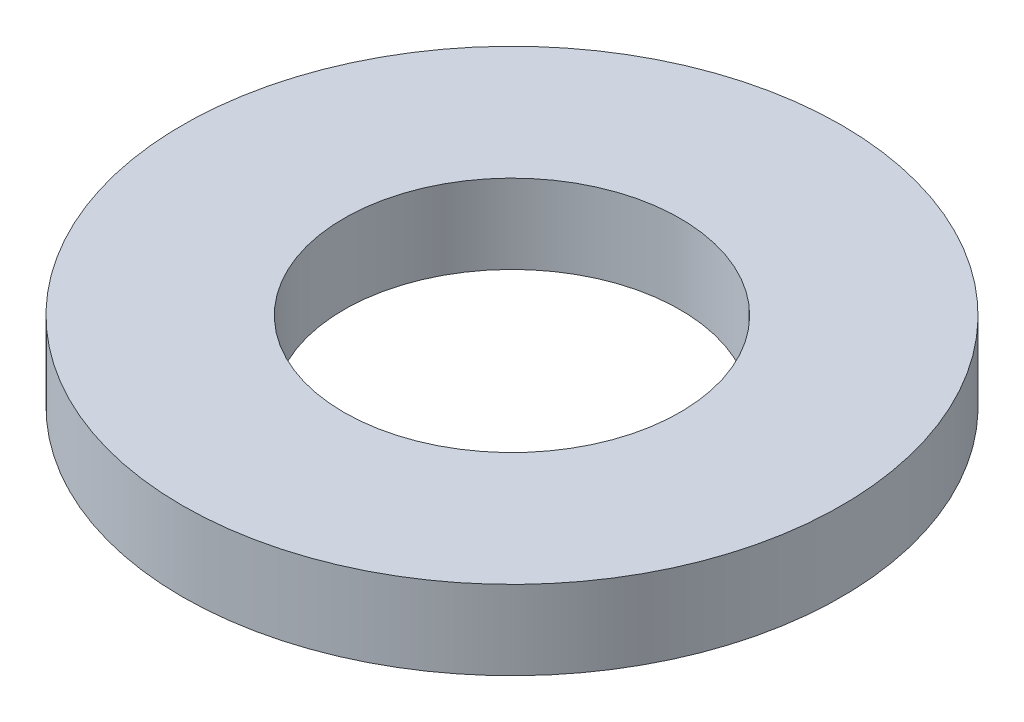
ISO-10303-21;
HEADER;
FILE_DESCRIPTION(('STEP AP214'),'2;1');
FILE_NAME('part.step','',(''),(''),'','','');
FILE_SCHEMA(('AUTOMOTIVE_DESIGN { 1 0 10303 214 1 1 1 1 }'));
ENDSEC;
DATA;
#1=APPLICATION_CONTEXT('core data for automotive mechanical design processes');
#2=APPLICATION_PROTOCOL_DEFINITION('international standard','automotive_design',2000,#1);
#3=PRODUCT_CONTEXT('',#1,'mechanical');
#4=PRODUCT('Part','Part','',(#3));
#5=PRODUCT_RELATED_PRODUCT_CATEGORY('part','',(#4));
#6=PRODUCT_DEFINITION_FORMATION('','',#4);
#7=PRODUCT_DEFINITION_CONTEXT('part definition',#1,'design');
#8=PRODUCT_DEFINITION('design','',#6,#7);
#9=PRODUCT_DEFINITION_SHAPE('','',#8);
#10=(LENGTH_UNIT() NAMED_UNIT(*) SI_UNIT(.MILLI.,.METRE.));
#11=(NAMED_UNIT(*) PLANE_ANGLE_UNIT() SI_UNIT($,.RADIAN.));
#12=(NAMED_UNIT(*) SI_UNIT($,.STERADIAN.) SOLID_ANGLE_UNIT());
#13=UNCERTAINTY_MEASURE_WITH_UNIT(LENGTH_MEASURE(1.E-05),#10,'distance_accuracy_value','');
#14=(GEOMETRIC_REPRESENTATION_CONTEXT(3) GLOBAL_UNCERTAINTY_ASSIGNED_CONTEXT((#13)) GLOBAL_UNIT_ASSIGNED_CONTEXT((#10,
#11,#12)) REPRESENTATION_CONTEXT('',''));
#15=CARTESIAN_POINT('',(0.,0.,0.));
#16=DIRECTION('',(0.,0.,1.));
#17=DIRECTION('',(1.,0.,0.));
#18=AXIS2_PLACEMENT_3D('',#15,#16,#17);
#19=CARTESIAN_POINT('',(0.,1.2,0.));
#20=DIRECTION('',(0.,-1.,0.));
#21=DIRECTION('',(0.,0.,-1.));
#22=AXIS2_PLACEMENT_3D('',#19,#20,#21);
#23=CYLINDRICAL_SURFACE('',#22,5.);
#24=CARTESIAN_POINT('',(0.,1.2,0.));
#25=DIRECTION('',(0.,1.,0.));
#26=DIRECTION('',(0.,0.,1.));
#27=AXIS2_PLACEMENT_3D('',#24,#25,#26);
#28=CIRCLE('',#27,5.);
#29=CARTESIAN_POINT('',(0.,1.2,5.));
#30=VERTEX_POINT('',#29);
#31=EDGE_CURVE('E10',#30,#30,#28,.T.);
#32=ORIENTED_EDGE('',*,*,#31,.F.);
#33=EDGE_LOOP('',(#32));
#34=FACE_BOUND('',#33,.T.);
#35=CARTESIAN_POINT('',(0.,0.,0.));
#36=DIRECTION('',(0.,1.,0.));
#37=DIRECTION('',(0.,0.,1.));
#38=AXIS2_PLACEMENT_3D('',#35,#36,#37);
#39=CIRCLE('',#38,5.);
#40=CARTESIAN_POINT('',(0.,0.,5.));
#41=VERTEX_POINT('',#40);
#42=EDGE_CURVE('E37',#41,#41,#39,.T.);
#43=ORIENTED_EDGE('',*,*,#42,.T.);
#44=EDGE_LOOP('',(#43));
#45=FACE_BOUND('',#44,.T.);
#46=ADVANCED_FACE('F34',(#34,#45),#23,.T.);
#47=CARTESIAN_POINT('',(0.,1.2,0.));
#48=DIRECTION('',(0.,1.,0.));
#49=DIRECTION('',(0.,0.,1.));
#50=AXIS2_PLACEMENT_3D('',#47,#48,#49);
#51=PLANE('',#50);
#52=CARTESIAN_POINT('',(0.,1.2,0.));
#53=DIRECTION('',(0.,1.,0.));
#54=DIRECTION('',(0.,0.,1.));
#55=AXIS2_PLACEMENT_3D('',#52,#53,#54);
#56=CIRCLE('',#55,2.55);
#57=CARTESIAN_POINT('',(0.,1.2,2.55));
#58=VERTEX_POINT('',#57);
#59=EDGE_CURVE('E46',#58,#58,#56,.T.);
#60=ORIENTED_EDGE('',*,*,#59,.F.);
#61=EDGE_LOOP('',(#60));
#62=FACE_BOUND('',#61,.T.);
#63=ORIENTED_EDGE('',*,*,#31,.T.);
#64=EDGE_LOOP('',(#63));
#65=FACE_BOUND('',#64,.T.);
#66=ADVANCED_FACE('F61',(#62,#65),#51,.T.);
#67=CARTESIAN_POINT('',(0.,0.,0.));
#68=DIRECTION('',(0.,1.,0.));
#69=DIRECTION('',(0.,0.,1.));
#70=AXIS2_PLACEMENT_3D('',#67,#68,#69);
#71=PLANE('',#70);
#72=CARTESIAN_POINT('',(0.,0.,0.));
#73=DIRECTION('',(0.,1.,0.));
#74=DIRECTION('',(0.,0.,1.));
#75=AXIS2_PLACEMENT_3D('',#72,#73,#74);
#76=CIRCLE('',#75,2.55);
#77=CARTESIAN_POINT('',(0.,0.,2.55));
#78=VERTEX_POINT('',#77);
#79=EDGE_CURVE('E44',#78,#78,#76,.T.);
#80=ORIENTED_EDGE('',*,*,#79,.T.);
#81=EDGE_LOOP('',(#80));
#82=FACE_BOUND('',#81,.T.);
#83=ORIENTED_EDGE('',*,*,#42,.F.);
#84=EDGE_LOOP('',(#83));
#85=FACE_BOUND('',#84,.T.);
#86=ADVANCED_FACE('F52',(#82,#85),#71,.F.);
#87=CARTESIAN_POINT('',(0.,0.,0.));
#88=DIRECTION('',(0.,1.,0.));
#89=DIRECTION('',(0.,0.,1.));
#90=AXIS2_PLACEMENT_3D('',#87,#88,#89);
#91=CYLINDRICAL_SURFACE('',#90,2.55);
#92=ORIENTED_EDGE('',*,*,#79,.F.);
#93=EDGE_LOOP('',(#92));
#94=FACE_BOUND('',#93,.T.);
#95=ORIENTED_EDGE('',*,*,#59,.T.);
#96=EDGE_LOOP('',(#95));
#97=FACE_BOUND('',#96,.T.);
#98=ADVANCED_FACE('F55',(#94,#97),#91,.F.);
#99=CLOSED_SHELL('',(#46,#66,#86,#98));
#100=MANIFOLD_SOLID_BREP('B2',#99);
#101=ADVANCED_BREP_SHAPE_REPRESENTATION('',(#18,#100),#14);
#102=SHAPE_DEFINITION_REPRESENTATION(#9,#101);
ENDSEC;
END-ISO-10303-21;
